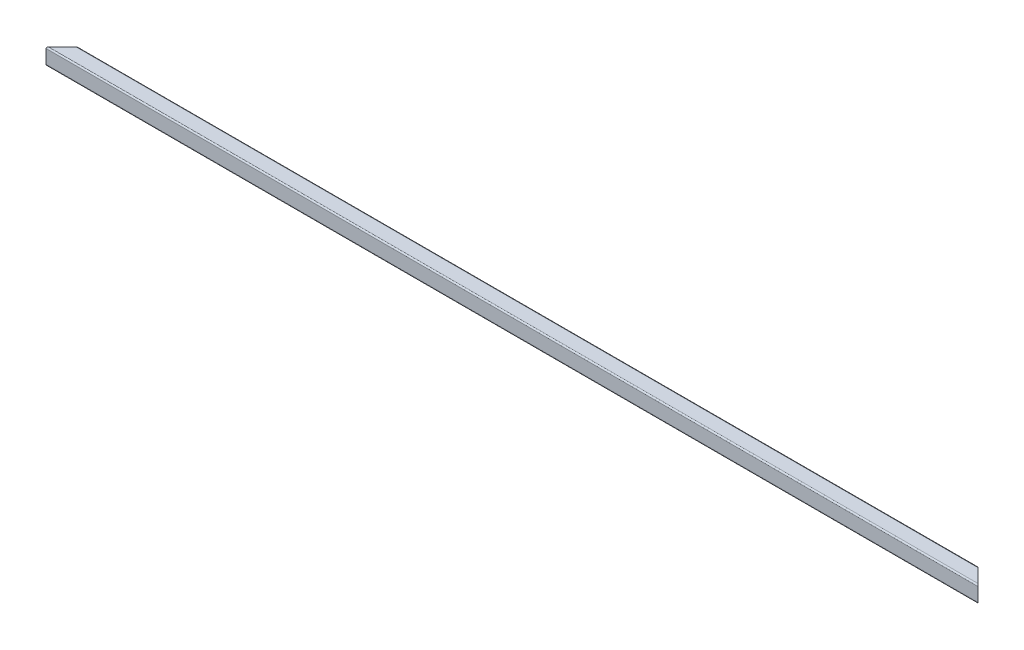
ISO-10303-21;
HEADER;
FILE_DESCRIPTION(('STEP AP214'),'2;1');
FILE_NAME('part.step','',(''),(''),'','','');
FILE_SCHEMA(('AUTOMOTIVE_DESIGN { 1 0 10303 214 1 1 1 1 }'));
ENDSEC;
DATA;
#1=APPLICATION_CONTEXT('core data for automotive mechanical design processes');
#2=APPLICATION_PROTOCOL_DEFINITION('international standard','automotive_design',2000,#1);
#3=PRODUCT_CONTEXT('',#1,'mechanical');
#4=PRODUCT('Part','Part','',(#3));
#5=PRODUCT_RELATED_PRODUCT_CATEGORY('part','',(#4));
#6=PRODUCT_DEFINITION_FORMATION('','',#4);
#7=PRODUCT_DEFINITION_CONTEXT('part definition',#1,'design');
#8=PRODUCT_DEFINITION('design','',#6,#7);
#9=PRODUCT_DEFINITION_SHAPE('','',#8);
#10=(LENGTH_UNIT() NAMED_UNIT(*) SI_UNIT(.MILLI.,.METRE.));
#11=(NAMED_UNIT(*) PLANE_ANGLE_UNIT() SI_UNIT($,.RADIAN.));
#12=(NAMED_UNIT(*) SI_UNIT($,.STERADIAN.) SOLID_ANGLE_UNIT());
#13=UNCERTAINTY_MEASURE_WITH_UNIT(LENGTH_MEASURE(1.E-05),#10,'distance_accuracy_value','');
#14=(GEOMETRIC_REPRESENTATION_CONTEXT(3) GLOBAL_UNCERTAINTY_ASSIGNED_CONTEXT((#13)) GLOBAL_UNIT_ASSIGNED_CONTEXT((#10,
#11,#12)) REPRESENTATION_CONTEXT('',''));
#15=CARTESIAN_POINT('',(0.,0.,0.));
#16=DIRECTION('',(0.,0.,1.));
#17=DIRECTION('',(1.,0.,0.));
#18=AXIS2_PLACEMENT_3D('',#15,#16,#17);
#19=CARTESIAN_POINT('',(723.9,20.574,20.574));
#20=DIRECTION('',(0.,0.,-1.));
#21=DIRECTION('',(0.,1.,0.));
#22=AXIS2_PLACEMENT_3D('',#19,#20,#21);
#23=PLANE('',#22);
#24=DIRECTION('',(0.,-1.,0.));
#25=VECTOR('',#24,1.);
#26=CARTESIAN_POINT('',(1.65099999999996,20.5740000000001,20.574));
#27=LINE('',#26,#25);
#28=CARTESIAN_POINT('',(1.65099999999996,20.574,20.574));
#29=VERTEX_POINT('',#28);
#30=CARTESIAN_POINT('',(1.65099999999996,11.176,20.574));
#31=VERTEX_POINT('',#30);
#32=EDGE_CURVE('E11',#29,#31,#27,.T.);
#33=ORIENTED_EDGE('',*,*,#32,.F.);
#34=DIRECTION('',(-1.,0.,0.));
#35=VECTOR('',#34,1.);
#36=CARTESIAN_POINT('',(723.9,20.574,20.574));
#37=LINE('',#36,#35);
#38=CARTESIAN_POINT('',(722.249,20.574,20.574));
#39=VERTEX_POINT('',#38);
#40=EDGE_CURVE('E171',#39,#29,#37,.T.);
#41=ORIENTED_EDGE('',*,*,#40,.F.);
#42=DIRECTION('',(0.,1.,0.));
#43=VECTOR('',#42,1.);
#44=CARTESIAN_POINT('',(722.249,20.574,20.574));
#45=LINE('',#44,#43);
#46=CARTESIAN_POINT('',(722.249,11.176,20.574));
#47=VERTEX_POINT('',#46);
#48=EDGE_CURVE('E50',#47,#39,#45,.T.);
#49=ORIENTED_EDGE('',*,*,#48,.F.);
#50=DIRECTION('',(-1.,0.,0.));
#51=VECTOR('',#50,1.);
#52=CARTESIAN_POINT('',(723.9,11.176,20.574));
#53=LINE('',#52,#51);
#54=EDGE_CURVE('E168',#47,#31,#53,.T.);
#55=ORIENTED_EDGE('',*,*,#54,.T.);
#56=EDGE_LOOP('',(#33,#41,#49,#55));
#57=FACE_BOUND('',#56,.T.);
#58=ADVANCED_FACE('F43',(#57),#23,.T.);
#59=CARTESIAN_POINT('',(723.9,20.574,11.176));
#60=DIRECTION('',(0.,-1.,0.));
#61=DIRECTION('',(0.,0.,-1.));
#62=AXIS2_PLACEMENT_3D('',#59,#60,#61);
#63=PLANE('',#62);
#64=DIRECTION('',(-0.707106781186551,0.,0.707106781186544));
#65=VECTOR('',#64,1.);
#66=CARTESIAN_POINT('',(367.474500000003,20.5740000000001,-345.2495));
#67=LINE('',#66,#65);
#68=CARTESIAN_POINT('',(11.0490000000002,20.574,11.176));
#69=VERTEX_POINT('',#68);
#70=EDGE_CURVE('E64',#69,#29,#67,.T.);
#71=ORIENTED_EDGE('',*,*,#70,.F.);
#72=DIRECTION('',(-1.,0.,0.));
#73=VECTOR('',#72,1.);
#74=CARTESIAN_POINT('',(723.9,20.574,11.176));
#75=LINE('',#74,#73);
#76=CARTESIAN_POINT('',(712.851,20.574,11.176));
#77=VERTEX_POINT('',#76);
#78=EDGE_CURVE('E177',#77,#69,#75,.T.);
#79=ORIENTED_EDGE('',*,*,#78,.F.);
#80=DIRECTION('',(-0.707106781186549,0.,-0.707106781186547));
#81=VECTOR('',#80,1.);
#82=CARTESIAN_POINT('',(718.3755,20.574,16.7005));
#83=LINE('',#82,#81);
#84=EDGE_CURVE('E232',#39,#77,#83,.T.);
#85=ORIENTED_EDGE('',*,*,#84,.F.);
#86=ORIENTED_EDGE('',*,*,#40,.T.);
#87=EDGE_LOOP('',(#71,#79,#85,#86));
#88=FACE_BOUND('',#87,.T.);
#89=ADVANCED_FACE('F259',(#88),#63,.T.);
#90=CARTESIAN_POINT('',(723.9,11.176,11.176));
#91=DIRECTION('',(0.,0.,1.));
#92=DIRECTION('',(1.,0.,0.));
#93=AXIS2_PLACEMENT_3D('',#90,#91,#92);
#94=PLANE('',#93);
#95=DIRECTION('',(0.,1.,0.));
#96=VECTOR('',#95,1.);
#97=CARTESIAN_POINT('',(11.0490000000002,11.1760000000002,11.176));
#98=LINE('',#97,#96);
#99=CARTESIAN_POINT('',(11.0490000000002,11.176,11.176));
#100=VERTEX_POINT('',#99);
#101=EDGE_CURVE('E221',#100,#69,#98,.T.);
#102=ORIENTED_EDGE('',*,*,#101,.F.);
#103=DIRECTION('',(-1.,0.,0.));
#104=VECTOR('',#103,1.);
#105=CARTESIAN_POINT('',(723.9,11.176,11.176));
#106=LINE('',#105,#104);
#107=CARTESIAN_POINT('',(712.851,11.176,11.176));
#108=VERTEX_POINT('',#107);
#109=EDGE_CURVE('E173',#108,#100,#106,.T.);
#110=ORIENTED_EDGE('',*,*,#109,.F.);
#111=DIRECTION('',(0.,-1.,0.));
#112=VECTOR('',#111,1.);
#113=CARTESIAN_POINT('',(712.851,11.176,11.176));
#114=LINE('',#113,#112);
#115=EDGE_CURVE('E230',#77,#108,#114,.T.);
#116=ORIENTED_EDGE('',*,*,#115,.F.);
#117=ORIENTED_EDGE('',*,*,#78,.T.);
#118=EDGE_LOOP('',(#102,#110,#116,#117));
#119=FACE_BOUND('',#118,.T.);
#120=ADVANCED_FACE('F264',(#119),#94,.T.);
#121=CARTESIAN_POINT('',(723.9,11.176,20.574));
#122=DIRECTION('',(0.,1.,0.));
#123=DIRECTION('',(0.,0.,1.));
#124=AXIS2_PLACEMENT_3D('',#121,#122,#123);
#125=PLANE('',#124);
#126=DIRECTION('',(0.707106781186551,0.,-0.707106781186544));
#127=VECTOR('',#126,1.);
#128=CARTESIAN_POINT('',(362.775500000003,11.176,-340.5505));
#129=LINE('',#128,#127);
#130=EDGE_CURVE('E219',#31,#100,#129,.T.);
#131=ORIENTED_EDGE('',*,*,#130,.F.);
#132=ORIENTED_EDGE('',*,*,#54,.F.);
#133=DIRECTION('',(0.707106781186549,0.,0.707106781186547));
#134=VECTOR('',#133,1.);
#135=CARTESIAN_POINT('',(723.0745,11.176,21.3995));
#136=LINE('',#135,#134);
#137=EDGE_CURVE('E57',#108,#47,#136,.T.);
#138=ORIENTED_EDGE('',*,*,#137,.F.);
#139=ORIENTED_EDGE('',*,*,#109,.T.);
#140=EDGE_LOOP('',(#131,#132,#138,#139));
#141=FACE_BOUND('',#140,.T.);
#142=ADVANCED_FACE('F275',(#141),#125,.T.);
#143=CARTESIAN_POINT('',(723.9,9.52499999999999,22.225));
#144=DIRECTION('',(-0.707106781186547,0.,0.707106781186549));
#145=DIRECTION('',(0.707106781186549,0.,0.707106781186547));
#146=AXIS2_PLACEMENT_3D('',#143,#144,#145);
#147=PLANE('',#146);
#148=ORIENTED_EDGE('',*,*,#137,.T.);
#149=ORIENTED_EDGE('',*,*,#48,.T.);
#150=ORIENTED_EDGE('',*,*,#84,.T.);
#151=ORIENTED_EDGE('',*,*,#115,.T.);
#152=EDGE_LOOP('',(#148,#149,#150,#151));
#153=FACE_BOUND('',#152,.T.);
#154=DIRECTION('',(0.707106781186548,0.,0.707106781186546));
#155=VECTOR('',#154,1.);
#156=CARTESIAN_POINT('',(723.9,9.52499999999999,22.225));
#157=LINE('',#156,#155);
#158=CARTESIAN_POINT('',(712.216,9.525,10.541));
#159=VERTEX_POINT('',#158);
#160=CARTESIAN_POINT('',(722.884,9.52499999999999,21.209));
#161=VERTEX_POINT('',#160);
#162=EDGE_CURVE('E152',#159,#161,#157,.T.);
#163=ORIENTED_EDGE('',*,*,#162,.F.);
#164=CARTESIAN_POINT('',(712.216,10.541,10.541));
#165=DIRECTION('',(-0.707106781186547,0.,0.707106781186549));
#166=DIRECTION('',(-0.707106781186549,0.,-0.707106781186547));
#167=AXIS2_PLACEMENT_3D('',#164,#165,#166);
#168=ELLIPSE('',#167,1.43684097937107,1.016);
#169=CARTESIAN_POINT('',(711.2,10.541,9.52499999999999));
#170=VERTEX_POINT('',#169);
#171=EDGE_CURVE('E140',#170,#159,#168,.T.);
#172=ORIENTED_EDGE('',*,*,#171,.F.);
#173=DIRECTION('',(0.,1.,0.));
#174=VECTOR('',#173,1.);
#175=CARTESIAN_POINT('',(711.2,9.525,9.52499999999999));
#176=LINE('',#175,#174);
#177=CARTESIAN_POINT('',(711.2,21.209,9.525));
#178=VERTEX_POINT('',#177);
#179=EDGE_CURVE('E135',#170,#178,#176,.T.);
#180=ORIENTED_EDGE('',*,*,#179,.T.);
#181=CARTESIAN_POINT('',(712.216,21.209,10.541));
#182=DIRECTION('',(-0.707106781186547,0.,0.707106781186549));
#183=DIRECTION('',(-0.707106781186549,0.,-0.707106781186547));
#184=AXIS2_PLACEMENT_3D('',#181,#182,#183);
#185=ELLIPSE('',#184,1.43684097937107,1.016);
#186=CARTESIAN_POINT('',(712.216,22.225,10.541));
#187=VERTEX_POINT('',#186);
#188=EDGE_CURVE('E129',#187,#178,#185,.T.);
#189=ORIENTED_EDGE('',*,*,#188,.F.);
#190=DIRECTION('',(0.707106781186548,0.,0.707106781186546));
#191=VECTOR('',#190,1.);
#192=CARTESIAN_POINT('',(723.9,22.225,22.225));
#193=LINE('',#192,#191);
#194=CARTESIAN_POINT('',(722.884,22.225,21.209));
#195=VERTEX_POINT('',#194);
#196=EDGE_CURVE('E132',#187,#195,#193,.T.);
#197=ORIENTED_EDGE('',*,*,#196,.T.);
#198=CARTESIAN_POINT('',(722.884,21.209,21.209));
#199=DIRECTION('',(-0.707106781186547,0.,0.707106781186549));
#200=DIRECTION('',(-0.707106781186549,0.,-0.707106781186547));
#201=AXIS2_PLACEMENT_3D('',#198,#199,#200);
#202=ELLIPSE('',#201,1.43684097937107,1.016);
#203=CARTESIAN_POINT('',(723.9,21.209,22.225));
#204=VERTEX_POINT('',#203);
#205=EDGE_CURVE('E141',#204,#195,#202,.T.);
#206=ORIENTED_EDGE('',*,*,#205,.F.);
#207=DIRECTION('',(0.,-1.,0.));
#208=VECTOR('',#207,1.);
#209=CARTESIAN_POINT('',(723.9,21.209,22.225));
#210=LINE('',#209,#208);
#211=CARTESIAN_POINT('',(723.9,10.541,22.225));
#212=VERTEX_POINT('',#211);
#213=EDGE_CURVE('E194',#204,#212,#210,.T.);
#214=ORIENTED_EDGE('',*,*,#213,.T.);
#215=CARTESIAN_POINT('',(722.884,10.541,21.209));
#216=DIRECTION('',(-0.707106781186547,0.,0.707106781186549));
#217=DIRECTION('',(-0.707106781186549,0.,-0.707106781186547));
#218=AXIS2_PLACEMENT_3D('',#215,#216,#217);
#219=ELLIPSE('',#218,1.43684097937107,1.016);
#220=EDGE_CURVE('E224',#161,#212,#219,.T.);
#221=ORIENTED_EDGE('',*,*,#220,.F.);
#222=EDGE_LOOP('',(#163,#172,#180,#189,#197,#206,#214,#221));
#223=FACE_BOUND('',#222,.T.);
#224=ADVANCED_FACE('F131',(#153,#223),#147,.F.);
#225=CARTESIAN_POINT('',(0.,9.52499999999999,22.225));
#226=DIRECTION('',(0.707106781186544,0.,0.707106781186551));
#227=DIRECTION('',(0.707106781186551,0.,-0.707106781186544));
#228=AXIS2_PLACEMENT_3D('',#225,#226,#227);
#229=PLANE('',#228);
#230=ORIENTED_EDGE('',*,*,#130,.T.);
#231=ORIENTED_EDGE('',*,*,#101,.T.);
#232=ORIENTED_EDGE('',*,*,#70,.T.);
#233=ORIENTED_EDGE('',*,*,#32,.T.);
#234=EDGE_LOOP('',(#230,#231,#232,#233));
#235=FACE_BOUND('',#234,.T.);
#236=DIRECTION('',(0.,-1.,0.));
#237=VECTOR('',#236,1.);
#238=CARTESIAN_POINT('',(0.,21.209,22.225));
#239=LINE('',#238,#237);
#240=CARTESIAN_POINT('',(0.,21.209,22.225));
#241=VERTEX_POINT('',#240);
#242=CARTESIAN_POINT('',(0.,10.541,22.225));
#243=VERTEX_POINT('',#242);
#244=EDGE_CURVE('E176',#241,#243,#239,.T.);
#245=ORIENTED_EDGE('',*,*,#244,.F.);
#246=CARTESIAN_POINT('',(1.01600000000002,21.209,21.209));
#247=DIRECTION('',(0.707106781186544,0.,0.707106781186551));
#248=DIRECTION('',(-0.707106781186551,0.,0.707106781186544));
#249=AXIS2_PLACEMENT_3D('',#246,#247,#248);
#250=ELLIPSE('',#249,1.43684097937107,1.016);
#251=CARTESIAN_POINT('',(1.016,22.225,21.209));
#252=VERTEX_POINT('',#251);
#253=EDGE_CURVE('E214',#252,#241,#250,.T.);
#254=ORIENTED_EDGE('',*,*,#253,.F.);
#255=DIRECTION('',(0.707106781186551,0.,-0.707106781186544));
#256=VECTOR('',#255,1.);
#257=CARTESIAN_POINT('',(0.,22.225,22.225));
#258=LINE('',#257,#256);
#259=CARTESIAN_POINT('',(11.6840000000001,22.225,10.541));
#260=VERTEX_POINT('',#259);
#261=EDGE_CURVE('E151',#252,#260,#258,.T.);
#262=ORIENTED_EDGE('',*,*,#261,.T.);
#263=CARTESIAN_POINT('',(11.684,21.209,10.541));
#264=DIRECTION('',(0.707106781186544,0.,0.707106781186551));
#265=DIRECTION('',(-0.707106781186551,0.,0.707106781186544));
#266=AXIS2_PLACEMENT_3D('',#263,#264,#265);
#267=ELLIPSE('',#266,1.43684097937107,1.016);
#268=CARTESIAN_POINT('',(12.7,21.209,9.52500000000012));
#269=VERTEX_POINT('',#268);
#270=EDGE_CURVE('E156',#269,#260,#267,.T.);
#271=ORIENTED_EDGE('',*,*,#270,.F.);
#272=DIRECTION('',(0.,1.,0.));
#273=VECTOR('',#272,1.);
#274=CARTESIAN_POINT('',(12.7,9.525,9.52500000000012));
#275=LINE('',#274,#273);
#276=CARTESIAN_POINT('',(12.7,10.541,9.52500000000012));
#277=VERTEX_POINT('',#276);
#278=EDGE_CURVE('E204',#277,#269,#275,.T.);
#279=ORIENTED_EDGE('',*,*,#278,.F.);
#280=CARTESIAN_POINT('',(11.684,10.541,10.541));
#281=DIRECTION('',(0.707106781186544,0.,0.707106781186551));
#282=DIRECTION('',(-0.707106781186551,0.,0.707106781186544));
#283=AXIS2_PLACEMENT_3D('',#280,#281,#282);
#284=ELLIPSE('',#283,1.43684097937107,1.016);
#285=CARTESIAN_POINT('',(11.6840000000001,9.525,10.541));
#286=VERTEX_POINT('',#285);
#287=EDGE_CURVE('E210',#286,#277,#284,.T.);
#288=ORIENTED_EDGE('',*,*,#287,.F.);
#289=DIRECTION('',(0.707106781186551,0.,-0.707106781186544));
#290=VECTOR('',#289,1.);
#291=CARTESIAN_POINT('',(0.,9.52499999999999,22.225));
#292=LINE('',#291,#290);
#293=CARTESIAN_POINT('',(1.01599999999994,9.52499999999999,21.2090000000001));
#294=VERTEX_POINT('',#293);
#295=EDGE_CURVE('E237',#294,#286,#292,.T.);
#296=ORIENTED_EDGE('',*,*,#295,.F.);
#297=CARTESIAN_POINT('',(1.01600000000002,10.541,21.209));
#298=DIRECTION('',(0.707106781186544,0.,0.707106781186551));
#299=DIRECTION('',(-0.707106781186551,0.,0.707106781186544));
#300=AXIS2_PLACEMENT_3D('',#297,#298,#299);
#301=ELLIPSE('',#300,1.43684097937107,1.016);
#302=EDGE_CURVE('E172',#243,#294,#301,.T.);
#303=ORIENTED_EDGE('',*,*,#302,.F.);
#304=EDGE_LOOP('',(#245,#254,#262,#271,#279,#288,#296,#303));
#305=FACE_BOUND('',#304,.T.);
#306=ADVANCED_FACE('F240',(#235,#305),#229,.F.);
#307=CARTESIAN_POINT('',(723.9,10.541,21.209));
#308=DIRECTION('',(-1.,0.,0.));
#309=DIRECTION('',(0.,0.,1.));
#310=AXIS2_PLACEMENT_3D('',#307,#308,#309);
#311=CYLINDRICAL_SURFACE('',#310,1.016);
#312=DIRECTION('',(-1.,0.,0.));
#313=VECTOR('',#312,1.);
#314=CARTESIAN_POINT('',(723.9,10.541,22.225));
#315=LINE('',#314,#313);
#316=EDGE_CURVE('E167',#212,#243,#315,.T.);
#317=ORIENTED_EDGE('',*,*,#316,.T.);
#318=ORIENTED_EDGE('',*,*,#302,.T.);
#319=DIRECTION('',(-1.,0.,0.));
#320=VECTOR('',#319,1.);
#321=CARTESIAN_POINT('',(723.9,9.525,21.209));
#322=LINE('',#321,#320);
#323=EDGE_CURVE('E181',#161,#294,#322,.T.);
#324=ORIENTED_EDGE('',*,*,#323,.F.);
#325=ORIENTED_EDGE('',*,*,#220,.T.);
#326=EDGE_LOOP('',(#317,#318,#324,#325));
#327=FACE_BOUND('',#326,.T.);
#328=ADVANCED_FACE('F242',(#327),#311,.T.);
#329=CARTESIAN_POINT('',(723.9,9.525,21.209));
#330=DIRECTION('',(0.,1.,0.));
#331=DIRECTION('',(0.,0.,1.));
#332=AXIS2_PLACEMENT_3D('',#329,#330,#331);
#333=PLANE('',#332);
#334=ORIENTED_EDGE('',*,*,#323,.T.);
#335=ORIENTED_EDGE('',*,*,#295,.T.);
#336=DIRECTION('',(-1.,0.,0.));
#337=VECTOR('',#336,1.);
#338=CARTESIAN_POINT('',(723.9,9.525,10.541));
#339=LINE('',#338,#337);
#340=EDGE_CURVE('E184',#159,#286,#339,.T.);
#341=ORIENTED_EDGE('',*,*,#340,.F.);
#342=ORIENTED_EDGE('',*,*,#162,.T.);
#343=EDGE_LOOP('',(#334,#335,#341,#342));
#344=FACE_BOUND('',#343,.T.);
#345=ADVANCED_FACE('F239',(#344),#333,.F.);
#346=CARTESIAN_POINT('',(723.9,10.541,10.541));
#347=DIRECTION('',(-1.,0.,0.));
#348=DIRECTION('',(0.,0.,1.));
#349=AXIS2_PLACEMENT_3D('',#346,#347,#348);
#350=CYLINDRICAL_SURFACE('',#349,1.016);
#351=ORIENTED_EDGE('',*,*,#340,.T.);
#352=ORIENTED_EDGE('',*,*,#287,.T.);
#353=DIRECTION('',(-1.,0.,0.));
#354=VECTOR('',#353,1.);
#355=CARTESIAN_POINT('',(723.9,10.541,9.525));
#356=LINE('',#355,#354);
#357=EDGE_CURVE('E159',#170,#277,#356,.T.);
#358=ORIENTED_EDGE('',*,*,#357,.F.);
#359=ORIENTED_EDGE('',*,*,#171,.T.);
#360=EDGE_LOOP('',(#351,#352,#358,#359));
#361=FACE_BOUND('',#360,.T.);
#362=ADVANCED_FACE('F208',(#361),#350,.T.);
#363=CARTESIAN_POINT('',(723.9,10.541,9.525));
#364=DIRECTION('',(0.,0.,1.));
#365=DIRECTION('',(1.,0.,0.));
#366=AXIS2_PLACEMENT_3D('',#363,#364,#365);
#367=PLANE('',#366);
#368=ORIENTED_EDGE('',*,*,#357,.T.);
#369=ORIENTED_EDGE('',*,*,#278,.T.);
#370=DIRECTION('',(-1.,0.,0.));
#371=VECTOR('',#370,1.);
#372=CARTESIAN_POINT('',(723.9,21.209,9.525));
#373=LINE('',#372,#371);
#374=EDGE_CURVE('E157',#178,#269,#373,.T.);
#375=ORIENTED_EDGE('',*,*,#374,.F.);
#376=ORIENTED_EDGE('',*,*,#179,.F.);
#377=EDGE_LOOP('',(#368,#369,#375,#376));
#378=FACE_BOUND('',#377,.T.);
#379=ADVANCED_FACE('F203',(#378),#367,.F.);
#380=CARTESIAN_POINT('',(723.9,21.209,10.541));
#381=DIRECTION('',(-1.,0.,0.));
#382=DIRECTION('',(0.,0.,1.));
#383=AXIS2_PLACEMENT_3D('',#380,#381,#382);
#384=CYLINDRICAL_SURFACE('',#383,1.016);
#385=ORIENTED_EDGE('',*,*,#374,.T.);
#386=ORIENTED_EDGE('',*,*,#270,.T.);
#387=DIRECTION('',(-1.,0.,0.));
#388=VECTOR('',#387,1.);
#389=CARTESIAN_POINT('',(723.9,22.225,10.541));
#390=LINE('',#389,#388);
#391=EDGE_CURVE('E148',#187,#260,#390,.T.);
#392=ORIENTED_EDGE('',*,*,#391,.F.);
#393=ORIENTED_EDGE('',*,*,#188,.T.);
#394=EDGE_LOOP('',(#385,#386,#392,#393));
#395=FACE_BOUND('',#394,.T.);
#396=ADVANCED_FACE('F155',(#395),#384,.T.);
#397=CARTESIAN_POINT('',(723.9,22.225,10.541));
#398=DIRECTION('',(0.,-1.,0.));
#399=DIRECTION('',(0.,0.,-1.));
#400=AXIS2_PLACEMENT_3D('',#397,#398,#399);
#401=PLANE('',#400);
#402=ORIENTED_EDGE('',*,*,#391,.T.);
#403=ORIENTED_EDGE('',*,*,#261,.F.);
#404=DIRECTION('',(-1.,0.,0.));
#405=VECTOR('',#404,1.);
#406=CARTESIAN_POINT('',(723.9,22.225,21.209));
#407=LINE('',#406,#405);
#408=EDGE_CURVE('E150',#195,#252,#407,.T.);
#409=ORIENTED_EDGE('',*,*,#408,.F.);
#410=ORIENTED_EDGE('',*,*,#196,.F.);
#411=EDGE_LOOP('',(#402,#403,#409,#410));
#412=FACE_BOUND('',#411,.T.);
#413=ADVANCED_FACE('F146',(#412),#401,.F.);
#414=CARTESIAN_POINT('',(723.9,21.209,21.209));
#415=DIRECTION('',(-1.,0.,0.));
#416=DIRECTION('',(0.,0.,1.));
#417=AXIS2_PLACEMENT_3D('',#414,#415,#416);
#418=CYLINDRICAL_SURFACE('',#417,1.016);
#419=ORIENTED_EDGE('',*,*,#408,.T.);
#420=ORIENTED_EDGE('',*,*,#253,.T.);
#421=DIRECTION('',(-1.,0.,0.));
#422=VECTOR('',#421,1.);
#423=CARTESIAN_POINT('',(723.9,21.209,22.225));
#424=LINE('',#423,#422);
#425=EDGE_CURVE('E161',#204,#241,#424,.T.);
#426=ORIENTED_EDGE('',*,*,#425,.F.);
#427=ORIENTED_EDGE('',*,*,#205,.T.);
#428=EDGE_LOOP('',(#419,#420,#426,#427));
#429=FACE_BOUND('',#428,.T.);
#430=ADVANCED_FACE('F249',(#429),#418,.T.);
#431=CARTESIAN_POINT('',(723.9,21.209,22.225));
#432=DIRECTION('',(0.,0.,-1.));
#433=DIRECTION('',(0.,1.,0.));
#434=AXIS2_PLACEMENT_3D('',#431,#432,#433);
#435=PLANE('',#434);
#436=ORIENTED_EDGE('',*,*,#244,.T.);
#437=ORIENTED_EDGE('',*,*,#316,.F.);
#438=ORIENTED_EDGE('',*,*,#213,.F.);
#439=ORIENTED_EDGE('',*,*,#425,.T.);
#440=EDGE_LOOP('',(#436,#437,#438,#439));
#441=FACE_BOUND('',#440,.T.);
#442=ADVANCED_FACE('F246',(#441),#435,.F.);
#443=CLOSED_SHELL('',(#58,#89,#120,#142,#224,#306,#328,#345,#362,#379,#396,#413,#430,#442));
#444=MANIFOLD_SOLID_BREP('B2',#443);
#445=ADVANCED_BREP_SHAPE_REPRESENTATION('',(#18,#444),#14);
#446=SHAPE_DEFINITION_REPRESENTATION(#9,#445);
ENDSEC;
END-ISO-10303-21;
